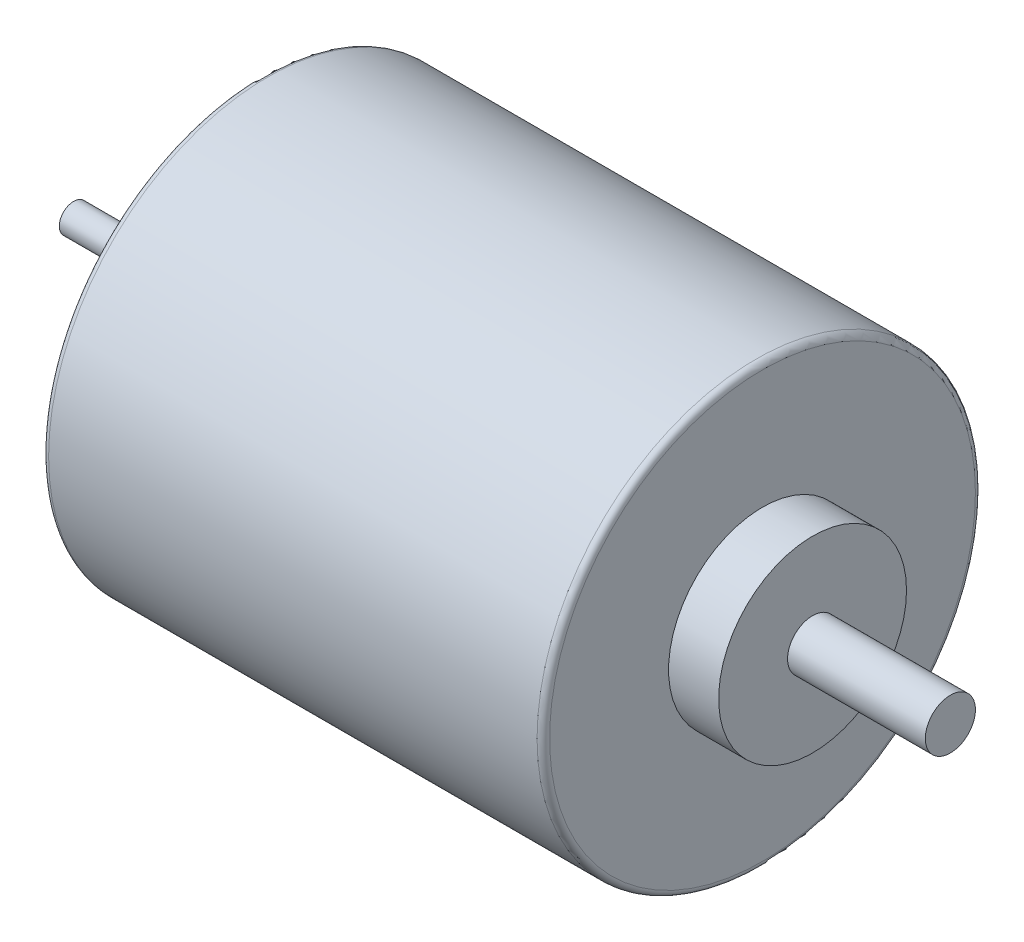
ISO-10303-21;
HEADER;
FILE_DESCRIPTION(('STEP AP214'),'2;1');
FILE_NAME('part.step','',(''),(''),'','','');
FILE_SCHEMA(('AUTOMOTIVE_DESIGN { 1 0 10303 214 1 1 1 1 }'));
ENDSEC;
DATA;
#1=APPLICATION_CONTEXT('core data for automotive mechanical design processes');
#2=APPLICATION_PROTOCOL_DEFINITION('international standard','automotive_design',2000,#1);
#3=PRODUCT_CONTEXT('',#1,'mechanical');
#4=PRODUCT('Part','Part','',(#3));
#5=PRODUCT_RELATED_PRODUCT_CATEGORY('part','',(#4));
#6=PRODUCT_DEFINITION_FORMATION('','',#4);
#7=PRODUCT_DEFINITION_CONTEXT('part definition',#1,'design');
#8=PRODUCT_DEFINITION('design','',#6,#7);
#9=PRODUCT_DEFINITION_SHAPE('','',#8);
#10=(LENGTH_UNIT() NAMED_UNIT(*) SI_UNIT(.MILLI.,.METRE.));
#11=(NAMED_UNIT(*) PLANE_ANGLE_UNIT() SI_UNIT($,.RADIAN.));
#12=(NAMED_UNIT(*) SI_UNIT($,.STERADIAN.) SOLID_ANGLE_UNIT());
#13=UNCERTAINTY_MEASURE_WITH_UNIT(LENGTH_MEASURE(1.E-05),#10,'distance_accuracy_value','');
#14=(GEOMETRIC_REPRESENTATION_CONTEXT(3) GLOBAL_UNCERTAINTY_ASSIGNED_CONTEXT((#13)) GLOBAL_UNIT_ASSIGNED_CONTEXT((#10,
#11,#12)) REPRESENTATION_CONTEXT('',''));
#15=CARTESIAN_POINT('',(0.,0.,0.));
#16=DIRECTION('',(0.,0.,1.));
#17=DIRECTION('',(1.,0.,0.));
#18=AXIS2_PLACEMENT_3D('',#15,#16,#17);
#19=CARTESIAN_POINT('',(-15.,0.,0.));
#20=DIRECTION('',(1.,0.,0.));
#21=DIRECTION('',(0.,0.,-1.));
#22=AXIS2_PLACEMENT_3D('',#19,#20,#21);
#23=CYLINDRICAL_SURFACE('',#22,1.145);
#24=CARTESIAN_POINT('',(-15.,0.,0.));
#25=DIRECTION('',(-1.,0.,0.));
#26=DIRECTION('',(0.,0.,1.));
#27=AXIS2_PLACEMENT_3D('',#24,#25,#26);
#28=CIRCLE('',#27,1.145);
#29=CARTESIAN_POINT('',(-15.,0.,1.145));
#30=VERTEX_POINT('',#29);
#31=EDGE_CURVE('E11',#30,#30,#28,.T.);
#32=ORIENTED_EDGE('',*,*,#31,.F.);
#33=EDGE_LOOP('',(#32));
#34=FACE_BOUND('',#33,.T.);
#35=CARTESIAN_POINT('',(0.,0.,0.));
#36=DIRECTION('',(-1.,0.,0.));
#37=DIRECTION('',(0.,0.,1.));
#38=AXIS2_PLACEMENT_3D('',#35,#36,#37);
#39=CIRCLE('',#38,1.145);
#40=CARTESIAN_POINT('',(0.,0.,1.145));
#41=VERTEX_POINT('',#40);
#42=EDGE_CURVE('E47',#41,#41,#39,.T.);
#43=ORIENTED_EDGE('',*,*,#42,.T.);
#44=EDGE_LOOP('',(#43));
#45=FACE_BOUND('',#44,.T.);
#46=ADVANCED_FACE('F44',(#34,#45),#23,.T.);
#47=CARTESIAN_POINT('',(-15.,0.,0.));
#48=DIRECTION('',(-1.,0.,0.));
#49=DIRECTION('',(0.,0.,1.));
#50=AXIS2_PLACEMENT_3D('',#47,#48,#49);
#51=PLANE('',#50);
#52=ORIENTED_EDGE('',*,*,#31,.T.);
#53=EDGE_LOOP('',(#52));
#54=FACE_BOUND('',#53,.T.);
#55=ADVANCED_FACE('F59',(#54),#51,.T.);
#56=CARTESIAN_POINT('',(0.,0.,0.));
#57=DIRECTION('',(-1.,0.,0.));
#58=DIRECTION('',(0.,0.,1.));
#59=AXIS2_PLACEMENT_3D('',#56,#57,#58);
#60=PLANE('',#59);
#61=ORIENTED_EDGE('',*,*,#42,.F.);
#62=EDGE_LOOP('',(#61));
#63=FACE_BOUND('',#62,.T.);
#64=ADVANCED_FACE('F57',(#63),#60,.F.);
#65=CLOSED_SHELL('',(#46,#55,#64));
#66=MANIFOLD_SOLID_BREP('B2',#65);
#67=CARTESIAN_POINT('',(44.,0.,0.));
#68=DIRECTION('',(-1.,0.,0.));
#69=DIRECTION('',(0.,0.,1.));
#70=AXIS2_PLACEMENT_3D('',#67,#68,#69);
#71=CYLINDRICAL_SURFACE('',#70,7.5);
#72=CARTESIAN_POINT('',(44.,0.,0.));
#73=DIRECTION('',(1.,0.,0.));
#74=DIRECTION('',(0.,0.,-1.));
#75=AXIS2_PLACEMENT_3D('',#72,#73,#74);
#76=CIRCLE('',#75,7.5);
#77=CARTESIAN_POINT('',(44.,0.,-7.5));
#78=VERTEX_POINT('',#77);
#79=EDGE_CURVE('E43',#78,#78,#76,.T.);
#80=ORIENTED_EDGE('',*,*,#79,.F.);
#81=EDGE_LOOP('',(#80));
#82=FACE_BOUND('',#81,.T.);
#83=CARTESIAN_POINT('',(40.,0.,0.));
#84=DIRECTION('',(1.,0.,0.));
#85=DIRECTION('',(0.,0.,-1.));
#86=AXIS2_PLACEMENT_3D('',#83,#84,#85);
#87=CIRCLE('',#86,7.5);
#88=CARTESIAN_POINT('',(40.,0.,-7.5));
#89=VERTEX_POINT('',#88);
#90=EDGE_CURVE('E96',#89,#89,#87,.T.);
#91=ORIENTED_EDGE('',*,*,#90,.T.);
#92=EDGE_LOOP('',(#91));
#93=FACE_BOUND('',#92,.T.);
#94=ADVANCED_FACE('F93',(#82,#93),#71,.T.);
#95=CARTESIAN_POINT('',(44.,0.,0.));
#96=DIRECTION('',(1.,0.,0.));
#97=DIRECTION('',(0.,0.,-1.));
#98=AXIS2_PLACEMENT_3D('',#95,#96,#97);
#99=PLANE('',#98);
#100=ORIENTED_EDGE('',*,*,#79,.T.);
#101=EDGE_LOOP('',(#100));
#102=FACE_BOUND('',#101,.T.);
#103=ADVANCED_FACE('F108',(#102),#99,.T.);
#104=CARTESIAN_POINT('',(40.,0.,0.));
#105=DIRECTION('',(1.,0.,0.));
#106=DIRECTION('',(0.,0.,-1.));
#107=AXIS2_PLACEMENT_3D('',#104,#105,#106);
#108=PLANE('',#107);
#109=ORIENTED_EDGE('',*,*,#90,.F.);
#110=EDGE_LOOP('',(#109));
#111=FACE_BOUND('',#110,.T.);
#112=ADVANCED_FACE('F106',(#111),#108,.F.);
#113=CLOSED_SHELL('',(#94,#103,#112));
#114=MANIFOLD_SOLID_BREP('B6',#113);
#115=CARTESIAN_POINT('',(55.,0.,0.));
#116=DIRECTION('',(-1.,0.,0.));
#117=DIRECTION('',(0.,0.,1.));
#118=AXIS2_PLACEMENT_3D('',#115,#116,#117);
#119=CYLINDRICAL_SURFACE('',#118,2.);
#120=CARTESIAN_POINT('',(55.,0.,0.));
#121=DIRECTION('',(1.,0.,0.));
#122=DIRECTION('',(0.,0.,-1.));
#123=AXIS2_PLACEMENT_3D('',#120,#121,#122);
#124=CIRCLE('',#123,2.);
#125=CARTESIAN_POINT('',(55.,0.,-2.));
#126=VERTEX_POINT('',#125);
#127=EDGE_CURVE('E92',#126,#126,#124,.T.);
#128=ORIENTED_EDGE('',*,*,#127,.F.);
#129=EDGE_LOOP('',(#128));
#130=FACE_BOUND('',#129,.T.);
#131=CARTESIAN_POINT('',(40.,0.,0.));
#132=DIRECTION('',(1.,0.,0.));
#133=DIRECTION('',(0.,0.,-1.));
#134=AXIS2_PLACEMENT_3D('',#131,#132,#133);
#135=CIRCLE('',#134,2.);
#136=CARTESIAN_POINT('',(40.,0.,-2.));
#137=VERTEX_POINT('',#136);
#138=EDGE_CURVE('E144',#137,#137,#135,.T.);
#139=ORIENTED_EDGE('',*,*,#138,.T.);
#140=EDGE_LOOP('',(#139));
#141=FACE_BOUND('',#140,.T.);
#142=ADVANCED_FACE('F141',(#130,#141),#119,.T.);
#143=CARTESIAN_POINT('',(55.,0.,0.));
#144=DIRECTION('',(1.,0.,0.));
#145=DIRECTION('',(0.,0.,-1.));
#146=AXIS2_PLACEMENT_3D('',#143,#144,#145);
#147=PLANE('',#146);
#148=ORIENTED_EDGE('',*,*,#127,.T.);
#149=EDGE_LOOP('',(#148));
#150=FACE_BOUND('',#149,.T.);
#151=ADVANCED_FACE('F156',(#150),#147,.T.);
#152=CARTESIAN_POINT('',(40.,0.,0.));
#153=DIRECTION('',(1.,0.,0.));
#154=DIRECTION('',(0.,0.,-1.));
#155=AXIS2_PLACEMENT_3D('',#152,#153,#154);
#156=PLANE('',#155);
#157=ORIENTED_EDGE('',*,*,#138,.F.);
#158=EDGE_LOOP('',(#157));
#159=FACE_BOUND('',#158,.T.);
#160=ADVANCED_FACE('F154',(#159),#156,.F.);
#161=CLOSED_SHELL('',(#142,#151,#160));
#162=MANIFOLD_SOLID_BREP('B38',#161);
#163=CARTESIAN_POINT('',(40.,0.,0.));
#164=DIRECTION('',(-1.,0.,0.));
#165=DIRECTION('',(0.,0.,1.));
#166=AXIS2_PLACEMENT_3D('',#163,#164,#165);
#167=CYLINDRICAL_SURFACE('',#166,17.5);
#168=CARTESIAN_POINT('',(39.5,0.,0.));
#169=DIRECTION('',(1.,0.,0.));
#170=DIRECTION('',(0.,0.,-1.));
#171=AXIS2_PLACEMENT_3D('',#168,#169,#170);
#172=CIRCLE('',#171,17.5);
#173=CARTESIAN_POINT('',(39.5,0.,-17.5));
#174=VERTEX_POINT('',#173);
#175=EDGE_CURVE('E140',#174,#174,#172,.F.);
#176=ORIENTED_EDGE('',*,*,#175,.T.);
#177=EDGE_LOOP('',(#176));
#178=FACE_BOUND('',#177,.T.);
#179=CARTESIAN_POINT('',(0.5,0.,0.));
#180=DIRECTION('',(1.,0.,0.));
#181=DIRECTION('',(0.,0.,-1.));
#182=AXIS2_PLACEMENT_3D('',#179,#180,#181);
#183=CIRCLE('',#182,17.5);
#184=CARTESIAN_POINT('',(0.5,0.,-17.5));
#185=VERTEX_POINT('',#184);
#186=EDGE_CURVE('E197',#185,#185,#183,.T.);
#187=ORIENTED_EDGE('',*,*,#186,.T.);
#188=EDGE_LOOP('',(#187));
#189=FACE_BOUND('',#188,.T.);
#190=ADVANCED_FACE('F182',(#178,#189),#167,.T.);
#191=CARTESIAN_POINT('',(40.,0.,0.));
#192=DIRECTION('',(1.,0.,0.));
#193=DIRECTION('',(0.,0.,-1.));
#194=AXIS2_PLACEMENT_3D('',#191,#192,#193);
#195=PLANE('',#194);
#196=CARTESIAN_POINT('',(40.,0.,0.));
#197=DIRECTION('',(1.,0.,0.));
#198=DIRECTION('',(0.,0.,-1.));
#199=AXIS2_PLACEMENT_3D('',#196,#197,#198);
#200=CIRCLE('',#199,17.);
#201=CARTESIAN_POINT('',(40.,0.,-17.));
#202=VERTEX_POINT('',#201);
#203=EDGE_CURVE('E189',#202,#202,#200,.T.);
#204=ORIENTED_EDGE('',*,*,#203,.T.);
#205=EDGE_LOOP('',(#204));
#206=FACE_BOUND('',#205,.T.);
#207=ADVANCED_FACE('F213',(#206),#195,.T.);
#208=CARTESIAN_POINT('',(0.,0.,0.));
#209=DIRECTION('',(1.,0.,0.));
#210=DIRECTION('',(0.,0.,-1.));
#211=AXIS2_PLACEMENT_3D('',#208,#209,#210);
#212=PLANE('',#211);
#213=CARTESIAN_POINT('',(0.,0.,0.));
#214=DIRECTION('',(1.,0.,0.));
#215=DIRECTION('',(0.,0.,-1.));
#216=AXIS2_PLACEMENT_3D('',#213,#214,#215);
#217=CIRCLE('',#216,17.);
#218=CARTESIAN_POINT('',(0.,0.,-17.));
#219=VERTEX_POINT('',#218);
#220=EDGE_CURVE('E193',#219,#219,#217,.F.);
#221=ORIENTED_EDGE('',*,*,#220,.T.);
#222=EDGE_LOOP('',(#221));
#223=FACE_BOUND('',#222,.T.);
#224=ADVANCED_FACE('F206',(#223),#212,.F.);
#225=CARTESIAN_POINT('',(0.5,0.,0.));
#226=DIRECTION('',(1.,0.,0.));
#227=DIRECTION('',(0.,0.,-1.));
#228=AXIS2_PLACEMENT_3D('',#225,#226,#227);
#229=TOROIDAL_SURFACE('',#228,17.,0.5);
#230=ORIENTED_EDGE('',*,*,#220,.F.);
#231=EDGE_LOOP('',(#230));
#232=FACE_BOUND('',#231,.T.);
#233=ORIENTED_EDGE('',*,*,#186,.F.);
#234=EDGE_LOOP('',(#233));
#235=FACE_BOUND('',#234,.T.);
#236=ADVANCED_FACE('F204',(#232,#235),#229,.T.);
#237=CARTESIAN_POINT('',(39.5,0.,0.));
#238=DIRECTION('',(1.,0.,0.));
#239=DIRECTION('',(0.,0.,-1.));
#240=AXIS2_PLACEMENT_3D('',#237,#238,#239);
#241=TOROIDAL_SURFACE('',#240,17.,0.5);
#242=ORIENTED_EDGE('',*,*,#175,.F.);
#243=EDGE_LOOP('',(#242));
#244=FACE_BOUND('',#243,.T.);
#245=ORIENTED_EDGE('',*,*,#203,.F.);
#246=EDGE_LOOP('',(#245));
#247=FACE_BOUND('',#246,.T.);
#248=ADVANCED_FACE('F184',(#244,#247),#241,.T.);
#249=CLOSED_SHELL('',(#190,#207,#224,#236,#248));
#250=MANIFOLD_SOLID_BREP('B87',#249);
#251=ADVANCED_BREP_SHAPE_REPRESENTATION('',(#18,#66,#114,#162,#250),#14);
#252=SHAPE_DEFINITION_REPRESENTATION(#9,#251);
ENDSEC;
END-ISO-10303-21;
